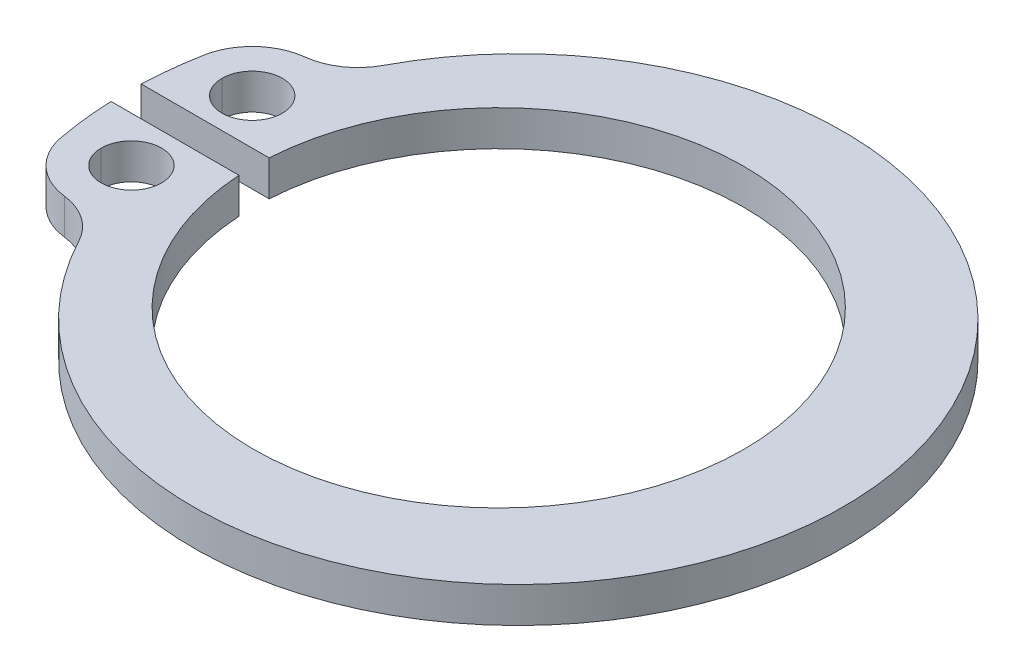
ISO-10303-21;
HEADER;
FILE_DESCRIPTION(('STEP AP214'),'2;1');
FILE_NAME('part.step','',(''),(''),'','','');
FILE_SCHEMA(('AUTOMOTIVE_DESIGN { 1 0 10303 214 1 1 1 1 }'));
ENDSEC;
DATA;
#1=APPLICATION_CONTEXT('core data for automotive mechanical design processes');
#2=APPLICATION_PROTOCOL_DEFINITION('international standard','automotive_design',2000,#1);
#3=PRODUCT_CONTEXT('',#1,'mechanical');
#4=PRODUCT('Part','Part','',(#3));
#5=PRODUCT_RELATED_PRODUCT_CATEGORY('part','',(#4));
#6=PRODUCT_DEFINITION_FORMATION('','',#4);
#7=PRODUCT_DEFINITION_CONTEXT('part definition',#1,'design');
#8=PRODUCT_DEFINITION('design','',#6,#7);
#9=PRODUCT_DEFINITION_SHAPE('','',#8);
#10=(LENGTH_UNIT() NAMED_UNIT(*) SI_UNIT(.MILLI.,.METRE.));
#11=(NAMED_UNIT(*) PLANE_ANGLE_UNIT() SI_UNIT($,.RADIAN.));
#12=(NAMED_UNIT(*) SI_UNIT($,.STERADIAN.) SOLID_ANGLE_UNIT());
#13=UNCERTAINTY_MEASURE_WITH_UNIT(LENGTH_MEASURE(1.E-05),#10,'distance_accuracy_value','');
#14=(GEOMETRIC_REPRESENTATION_CONTEXT(3) GLOBAL_UNCERTAINTY_ASSIGNED_CONTEXT((#13)) GLOBAL_UNIT_ASSIGNED_CONTEXT((#10,
#11,#12)) REPRESENTATION_CONTEXT('',''));
#15=CARTESIAN_POINT('',(0.,0.,0.));
#16=DIRECTION('',(0.,0.,1.));
#17=DIRECTION('',(1.,0.,0.));
#18=AXIS2_PLACEMENT_3D('',#15,#16,#17);
#19=CARTESIAN_POINT('',(-9.039204520387,0.,-5.076382241931));
#20=DIRECTION('',(0.,1.,0.));
#21=DIRECTION('',(1.,0.,0.));
#22=AXIS2_PLACEMENT_3D('',#19,#20,#21);
#23=CYLINDRICAL_SURFACE('',#22,1.7);
#24=DIRECTION('',(0.,1.,0.));
#25=VECTOR('',#24,1.);
#26=CARTESIAN_POINT('',(-8.839177674455,0.,-3.388191120965));
#27=LINE('',#26,#25);
#28=CARTESIAN_POINT('',(-8.839177674455,0.,-3.388191120965));
#29=VERTEX_POINT('',#28);
#30=CARTESIAN_POINT('',(-8.839177674455,1.,-3.388191120965));
#31=VERTEX_POINT('',#30);
#32=EDGE_CURVE('E11',#29,#31,#27,.T.);
#33=ORIENTED_EDGE('',*,*,#32,.T.);
#34=CARTESIAN_POINT('',(-9.039204520387,1.,-5.076382241931));
#35=DIRECTION('',(0.,-1.,0.));
#36=DIRECTION('',(0.883797651648546,0.,0.467869331053571));
#37=AXIS2_PLACEMENT_3D('',#34,#35,#36);
#38=CIRCLE('',#37,1.7);
#39=CARTESIAN_POINT('',(-7.536748512584,1.,-4.28100437914));
#40=VERTEX_POINT('',#39);
#41=EDGE_CURVE('E230',#40,#31,#38,.T.);
#42=ORIENTED_EDGE('',*,*,#41,.F.);
#43=DIRECTION('',(0.,1.,0.));
#44=VECTOR('',#43,1.);
#45=CARTESIAN_POINT('',(-7.536748512584,0.,-4.28100437914));
#46=LINE('',#45,#44);
#47=CARTESIAN_POINT('',(-7.536748512584,0.,-4.28100437914));
#48=VERTEX_POINT('',#47);
#49=EDGE_CURVE('E292',#48,#40,#46,.T.);
#50=ORIENTED_EDGE('',*,*,#49,.F.);
#51=CARTESIAN_POINT('',(-9.039204520387,0.,-5.076382241931));
#52=DIRECTION('',(0.,-1.,0.));
#53=DIRECTION('',(0.883797651648546,0.,0.467869331053571));
#54=AXIS2_PLACEMENT_3D('',#51,#52,#53);
#55=CIRCLE('',#54,1.7);
#56=EDGE_CURVE('E224',#48,#29,#55,.T.);
#57=ORIENTED_EDGE('',*,*,#56,.T.);
#58=EDGE_LOOP('',(#33,#42,#50,#57));
#59=FACE_BOUND('',#58,.T.);
#60=ADVANCED_FACE('F16',(#59),#23,.F.);
#61=CARTESIAN_POINT('',(-8.639150828524,0.,-1.7));
#62=DIRECTION('',(0.,1.,0.));
#63=DIRECTION('',(1.,0.,0.));
#64=AXIS2_PLACEMENT_3D('',#61,#62,#63);
#65=CYLINDRICAL_SURFACE('',#64,1.7);
#66=DIRECTION('',(0.,1.,0.));
#67=VECTOR('',#66,1.);
#68=CARTESIAN_POINT('',(-10.31078540483,0.,-2.009253687609));
#69=LINE('',#68,#67);
#70=CARTESIAN_POINT('',(-10.31078540483,0.,-2.009253687609));
#71=VERTEX_POINT('',#70);
#72=CARTESIAN_POINT('',(-10.31078540483,1.,-2.009253687609));
#73=VERTEX_POINT('',#72);
#74=EDGE_CURVE('E25',#71,#73,#69,.T.);
#75=ORIENTED_EDGE('',*,*,#74,.T.);
#76=CARTESIAN_POINT('',(-8.639150828524,1.,-1.7));
#77=DIRECTION('',(0.,1.,0.));
#78=DIRECTION('',(-0.117662850548003,0.,-0.993053600567924));
#79=AXIS2_PLACEMENT_3D('',#76,#77,#78);
#80=CIRCLE('',#79,1.7);
#81=EDGE_CURVE('E254',#31,#73,#80,.T.);
#82=ORIENTED_EDGE('',*,*,#81,.F.);
#83=ORIENTED_EDGE('',*,*,#32,.F.);
#84=CARTESIAN_POINT('',(-8.639150828524,0.,-1.7));
#85=DIRECTION('',(0.,1.,0.));
#86=DIRECTION('',(-0.117662850548003,0.,-0.993053600567924));
#87=AXIS2_PLACEMENT_3D('',#84,#85,#86);
#88=CIRCLE('',#87,1.7);
#89=EDGE_CURVE('E219',#29,#71,#88,.T.);
#90=ORIENTED_EDGE('',*,*,#89,.T.);
#91=EDGE_LOOP('',(#75,#82,#83,#90));
#92=FACE_BOUND('',#91,.T.);
#93=ADVANCED_FACE('F311',(#92),#65,.T.);
#94=CARTESIAN_POINT('',(0.55,0.,0.));
#95=DIRECTION('',(0.,1.,0.));
#96=DIRECTION('',(1.,0.,0.));
#97=AXIS2_PLACEMENT_3D('',#94,#95,#96);
#98=CYLINDRICAL_SURFACE('',#97,11.04507854164);
#99=DIRECTION('',(0.,1.,0.));
#100=VECTOR('',#99,1.);
#101=CARTESIAN_POINT('',(-10.48689879409,0.,-0.425));
#102=LINE('',#101,#100);
#103=CARTESIAN_POINT('',(-10.48689879409,0.,-0.425));
#104=VERTEX_POINT('',#103);
#105=CARTESIAN_POINT('',(-10.48689879409,1.,-0.425));
#106=VERTEX_POINT('',#105);
#107=EDGE_CURVE('E164',#104,#106,#102,.T.);
#108=ORIENTED_EDGE('',*,*,#107,.T.);
#109=CARTESIAN_POINT('',(0.55,1.,0.));
#110=DIRECTION('',(0.,1.,0.));
#111=DIRECTION('',(-0.983314456650295,0.,-0.181913933887799));
#112=AXIS2_PLACEMENT_3D('',#109,#110,#111);
#113=CIRCLE('',#112,11.04507854164);
#114=EDGE_CURVE('E190',#73,#106,#113,.T.);
#115=ORIENTED_EDGE('',*,*,#114,.F.);
#116=ORIENTED_EDGE('',*,*,#74,.F.);
#117=CARTESIAN_POINT('',(0.55,0.,0.));
#118=DIRECTION('',(0.,1.,0.));
#119=DIRECTION('',(-0.983314456650295,0.,-0.181913933887799));
#120=AXIS2_PLACEMENT_3D('',#117,#118,#119);
#121=CIRCLE('',#120,11.04507854164);
#122=EDGE_CURVE('E173',#71,#104,#121,.T.);
#123=ORIENTED_EDGE('',*,*,#122,.T.);
#124=EDGE_LOOP('',(#108,#115,#116,#123));
#125=FACE_BOUND('',#124,.T.);
#126=ADVANCED_FACE('F315',(#125),#98,.T.);
#127=CARTESIAN_POINT('',(-10.48689879409,0.,-0.425));
#128=DIRECTION('',(0.,0.,1.));
#129=DIRECTION('',(1.,0.,0.));
#130=AXIS2_PLACEMENT_3D('',#127,#128,#129);
#131=PLANE('',#130);
#132=DIRECTION('',(0.,1.,0.));
#133=VECTOR('',#132,1.);
#134=CARTESIAN_POINT('',(-6.886898794087,0.,-0.425));
#135=LINE('',#134,#133);
#136=CARTESIAN_POINT('',(-6.886898794087,0.,-0.425));
#137=VERTEX_POINT('',#136);
#138=CARTESIAN_POINT('',(-6.886898794087,1.,-0.425));
#139=VERTEX_POINT('',#138);
#140=EDGE_CURVE('E152',#137,#139,#135,.T.);
#141=ORIENTED_EDGE('',*,*,#140,.T.);
#142=DIRECTION('',(1.,0.,0.));
#143=VECTOR('',#142,1.);
#144=CARTESIAN_POINT('',(-10.48689879409,1.,-0.425));
#145=LINE('',#144,#143);
#146=EDGE_CURVE('E258',#106,#139,#145,.T.);
#147=ORIENTED_EDGE('',*,*,#146,.F.);
#148=ORIENTED_EDGE('',*,*,#107,.F.);
#149=DIRECTION('',(1.,0.,0.));
#150=VECTOR('',#149,1.);
#151=CARTESIAN_POINT('',(-10.48689879409,0.,-0.425));
#152=LINE('',#151,#150);
#153=EDGE_CURVE('E168',#104,#137,#152,.T.);
#154=ORIENTED_EDGE('',*,*,#153,.T.);
#155=EDGE_LOOP('',(#141,#147,#148,#154));
#156=FACE_BOUND('',#155,.T.);
#157=ADVANCED_FACE('F18',(#156),#131,.T.);
#158=CARTESIAN_POINT('',(0.,0.,0.));
#159=DIRECTION('',(0.,1.,0.));
#160=DIRECTION('',(1.,0.,0.));
#161=AXIS2_PLACEMENT_3D('',#158,#159,#160);
#162=CYLINDRICAL_SURFACE('',#161,6.9);
#163=DIRECTION('',(0.,1.,0.));
#164=VECTOR('',#163,1.);
#165=CARTESIAN_POINT('',(-6.886898794087,0.,0.425));
#166=LINE('',#165,#164);
#167=CARTESIAN_POINT('',(-6.886898794087,0.,0.425));
#168=VERTEX_POINT('',#167);
#169=CARTESIAN_POINT('',(-6.886898794087,1.,0.425));
#170=VERTEX_POINT('',#169);
#171=EDGE_CURVE('E165',#168,#170,#166,.T.);
#172=ORIENTED_EDGE('',*,*,#171,.T.);
#173=CARTESIAN_POINT('',(0.,1.,0.));
#174=DIRECTION('',(0.,-1.,0.));
#175=DIRECTION('',(-0.998101274505394,0.,-0.0615942028985497));
#176=AXIS2_PLACEMENT_3D('',#173,#174,#175);
#177=CIRCLE('',#176,6.9);
#178=EDGE_CURVE('E159',#139,#170,#177,.T.);
#179=ORIENTED_EDGE('',*,*,#178,.F.);
#180=ORIENTED_EDGE('',*,*,#140,.F.);
#181=CARTESIAN_POINT('',(0.,0.,0.));
#182=DIRECTION('',(0.,-1.,0.));
#183=DIRECTION('',(-0.998101274505394,0.,-0.0615942028985497));
#184=AXIS2_PLACEMENT_3D('',#181,#182,#183);
#185=CIRCLE('',#184,6.9);
#186=EDGE_CURVE('E156',#137,#168,#185,.T.);
#187=ORIENTED_EDGE('',*,*,#186,.T.);
#188=EDGE_LOOP('',(#172,#179,#180,#187));
#189=FACE_BOUND('',#188,.T.);
#190=ADVANCED_FACE('F154',(#189),#162,.F.);
#191=CARTESIAN_POINT('',(-6.886898794087,0.,0.425));
#192=DIRECTION('',(0.,0.,-1.));
#193=DIRECTION('',(0.,-1.,0.));
#194=AXIS2_PLACEMENT_3D('',#191,#192,#193);
#195=PLANE('',#194);
#196=DIRECTION('',(0.,1.,0.));
#197=VECTOR('',#196,1.);
#198=CARTESIAN_POINT('',(-10.48689879409,0.,0.425));
#199=LINE('',#198,#197);
#200=CARTESIAN_POINT('',(-10.48689879409,0.,0.425));
#201=VERTEX_POINT('',#200);
#202=CARTESIAN_POINT('',(-10.48689879409,1.,0.425));
#203=VERTEX_POINT('',#202);
#204=EDGE_CURVE('E261',#201,#203,#199,.T.);
#205=ORIENTED_EDGE('',*,*,#204,.T.);
#206=DIRECTION('',(-1.,0.,0.));
#207=VECTOR('',#206,1.);
#208=CARTESIAN_POINT('',(-6.886898794087,1.,0.425));
#209=LINE('',#208,#207);
#210=EDGE_CURVE('E267',#170,#203,#209,.T.);
#211=ORIENTED_EDGE('',*,*,#210,.F.);
#212=ORIENTED_EDGE('',*,*,#171,.F.);
#213=DIRECTION('',(-1.,0.,0.));
#214=VECTOR('',#213,1.);
#215=CARTESIAN_POINT('',(-6.886898794087,0.,0.425));
#216=LINE('',#215,#214);
#217=EDGE_CURVE('E179',#168,#201,#216,.T.);
#218=ORIENTED_EDGE('',*,*,#217,.T.);
#219=EDGE_LOOP('',(#205,#211,#212,#218));
#220=FACE_BOUND('',#219,.T.);
#221=ADVANCED_FACE('F336',(#220),#195,.T.);
#222=CARTESIAN_POINT('',(0.55,0.,0.));
#223=DIRECTION('',(0.,1.,0.));
#224=DIRECTION('',(1.,0.,0.));
#225=AXIS2_PLACEMENT_3D('',#222,#223,#224);
#226=CYLINDRICAL_SURFACE('',#225,11.04507854164);
#227=DIRECTION('',(0.,1.,0.));
#228=VECTOR('',#227,1.);
#229=CARTESIAN_POINT('',(-10.31078540483,0.,2.009253687609));
#230=LINE('',#229,#228);
#231=CARTESIAN_POINT('',(-10.31078540483,0.,2.009253687609));
#232=VERTEX_POINT('',#231);
#233=CARTESIAN_POINT('',(-10.31078540483,1.,2.009253687609));
#234=VERTEX_POINT('',#233);
#235=EDGE_CURVE('E264',#232,#234,#230,.T.);
#236=ORIENTED_EDGE('',*,*,#235,.T.);
#237=CARTESIAN_POINT('',(0.55,1.,0.));
#238=DIRECTION('',(0.,1.,0.));
#239=DIRECTION('',(-0.999259421513512,0.,0.0384786761269205));
#240=AXIS2_PLACEMENT_3D('',#237,#238,#239);
#241=CIRCLE('',#240,11.04507854164);
#242=EDGE_CURVE('E271',#203,#234,#241,.T.);
#243=ORIENTED_EDGE('',*,*,#242,.F.);
#244=ORIENTED_EDGE('',*,*,#204,.F.);
#245=CARTESIAN_POINT('',(0.55,0.,0.));
#246=DIRECTION('',(0.,1.,0.));
#247=DIRECTION('',(-0.999259421513512,0.,0.0384786761269205));
#248=AXIS2_PLACEMENT_3D('',#245,#246,#247);
#249=CIRCLE('',#248,11.04507854164);
#250=EDGE_CURVE('E186',#201,#232,#249,.T.);
#251=ORIENTED_EDGE('',*,*,#250,.T.);
#252=EDGE_LOOP('',(#236,#243,#244,#251));
#253=FACE_BOUND('',#252,.T.);
#254=ADVANCED_FACE('F332',(#253),#226,.T.);
#255=CARTESIAN_POINT('',(-8.639150828524,0.,1.7));
#256=DIRECTION('',(0.,1.,0.));
#257=DIRECTION('',(1.,0.,0.));
#258=AXIS2_PLACEMENT_3D('',#255,#256,#257);
#259=CYLINDRICAL_SURFACE('',#258,1.7);
#260=DIRECTION('',(0.,1.,0.));
#261=VECTOR('',#260,1.);
#262=CARTESIAN_POINT('',(-8.839177674455,0.,3.388191120965));
#263=LINE('',#262,#261);
#264=CARTESIAN_POINT('',(-8.839177674455,0.,3.388191120965));
#265=VERTEX_POINT('',#264);
#266=CARTESIAN_POINT('',(-8.839177674455,1.,3.388191120965));
#267=VERTEX_POINT('',#266);
#268=EDGE_CURVE('E298',#265,#267,#263,.T.);
#269=ORIENTED_EDGE('',*,*,#268,.T.);
#270=CARTESIAN_POINT('',(-8.639150828524,1.,1.7));
#271=DIRECTION('',(0.,1.,0.));
#272=DIRECTION('',(-0.983314456650277,0.,0.181913933887896));
#273=AXIS2_PLACEMENT_3D('',#270,#271,#272);
#274=CIRCLE('',#273,1.7);
#275=EDGE_CURVE('E275',#234,#267,#274,.T.);
#276=ORIENTED_EDGE('',*,*,#275,.F.);
#277=ORIENTED_EDGE('',*,*,#235,.F.);
#278=CARTESIAN_POINT('',(-8.639150828524,0.,1.7));
#279=DIRECTION('',(0.,1.,0.));
#280=DIRECTION('',(-0.983314456650277,0.,0.181913933887896));
#281=AXIS2_PLACEMENT_3D('',#278,#279,#280);
#282=CIRCLE('',#281,1.7);
#283=EDGE_CURVE('E200',#232,#265,#282,.T.);
#284=ORIENTED_EDGE('',*,*,#283,.T.);
#285=EDGE_LOOP('',(#269,#276,#277,#284));
#286=FACE_BOUND('',#285,.T.);
#287=ADVANCED_FACE('F330',(#286),#259,.T.);
#288=CARTESIAN_POINT('',(-9.039204520387,0.,5.076382241931));
#289=DIRECTION('',(0.,1.,0.));
#290=DIRECTION('',(1.,0.,0.));
#291=AXIS2_PLACEMENT_3D('',#288,#289,#290);
#292=CYLINDRICAL_SURFACE('',#291,1.7);
#293=DIRECTION('',(0.,1.,0.));
#294=VECTOR('',#293,1.);
#295=CARTESIAN_POINT('',(-7.536748512584,0.,4.28100437914));
#296=LINE('',#295,#294);
#297=CARTESIAN_POINT('',(-7.536748512584,0.,4.28100437914));
#298=VERTEX_POINT('',#297);
#299=CARTESIAN_POINT('',(-7.536748512584,1.,4.28100437914));
#300=VERTEX_POINT('',#299);
#301=EDGE_CURVE('E295',#298,#300,#296,.T.);
#302=ORIENTED_EDGE('',*,*,#301,.T.);
#303=CARTESIAN_POINT('',(-9.039204520387,1.,5.076382241931));
#304=DIRECTION('',(0.,-1.,0.));
#305=DIRECTION('',(0.117662850547904,0.,-0.993053600567936));
#306=AXIS2_PLACEMENT_3D('',#303,#304,#305);
#307=CIRCLE('',#306,1.7);
#308=EDGE_CURVE('E195',#267,#300,#307,.T.);
#309=ORIENTED_EDGE('',*,*,#308,.F.);
#310=ORIENTED_EDGE('',*,*,#268,.F.);
#311=CARTESIAN_POINT('',(-9.039204520387,0.,5.076382241931));
#312=DIRECTION('',(0.,-1.,0.));
#313=DIRECTION('',(0.117662850547904,0.,-0.993053600567936));
#314=AXIS2_PLACEMENT_3D('',#311,#312,#313);
#315=CIRCLE('',#314,1.7);
#316=EDGE_CURVE('E196',#265,#298,#315,.T.);
#317=ORIENTED_EDGE('',*,*,#316,.T.);
#318=EDGE_LOOP('',(#302,#309,#310,#317));
#319=FACE_BOUND('',#318,.T.);
#320=ADVANCED_FACE('F326',(#319),#292,.F.);
#321=CARTESIAN_POINT('',(0.55,0.,0.));
#322=DIRECTION('',(0.,1.,0.));
#323=DIRECTION('',(1.,0.,0.));
#324=AXIS2_PLACEMENT_3D('',#321,#322,#323);
#325=CYLINDRICAL_SURFACE('',#324,9.15);
#326=ORIENTED_EDGE('',*,*,#49,.T.);
#327=CARTESIAN_POINT('',(0.55,1.,0.));
#328=DIRECTION('',(0.,1.,0.));
#329=DIRECTION('',(-0.883797651648587,0.,0.467869331053493));
#330=AXIS2_PLACEMENT_3D('',#327,#328,#329);
#331=CIRCLE('',#330,9.15);
#332=EDGE_CURVE('E191',#300,#40,#331,.T.);
#333=ORIENTED_EDGE('',*,*,#332,.F.);
#334=ORIENTED_EDGE('',*,*,#301,.F.);
#335=CARTESIAN_POINT('',(0.55,0.,0.));
#336=DIRECTION('',(0.,1.,0.));
#337=DIRECTION('',(-0.883797651648587,0.,0.467869331053493));
#338=AXIS2_PLACEMENT_3D('',#335,#336,#337);
#339=CIRCLE('',#338,9.15);
#340=EDGE_CURVE('E208',#298,#48,#339,.T.);
#341=ORIENTED_EDGE('',*,*,#340,.T.);
#342=EDGE_LOOP('',(#326,#333,#334,#341));
#343=FACE_BOUND('',#342,.T.);
#344=ADVANCED_FACE('F365',(#343),#325,.T.);
#345=CARTESIAN_POINT('',(-8.639150828524,0.,-1.7));
#346=DIRECTION('',(0.,1.,0.));
#347=DIRECTION('',(1.,0.,0.));
#348=AXIS2_PLACEMENT_3D('',#345,#346,#347);
#349=CYLINDRICAL_SURFACE('',#348,0.85);
#350=DIRECTION('',(0.,1.,0.));
#351=VECTOR('',#350,1.);
#352=CARTESIAN_POINT('',(-7.789150828524,0.,-1.7));
#353=LINE('',#352,#351);
#354=CARTESIAN_POINT('',(-7.789150828524,0.,-1.7));
#355=VERTEX_POINT('',#354);
#356=CARTESIAN_POINT('',(-7.789150828524,1.,-1.7));
#357=VERTEX_POINT('',#356);
#358=EDGE_CURVE('E37',#355,#357,#353,.T.);
#359=ORIENTED_EDGE('',*,*,#358,.T.);
#360=CARTESIAN_POINT('',(-8.639150828524,1.,-1.7));
#361=DIRECTION('',(0.,-1.,0.));
#362=DIRECTION('',(-1.,0.,0.));
#363=AXIS2_PLACEMENT_3D('',#360,#361,#362);
#364=CIRCLE('',#363,0.85);
#365=CARTESIAN_POINT('',(-9.489150828524,1.,-1.7));
#366=VERTEX_POINT('',#365);
#367=EDGE_CURVE('E194',#366,#357,#364,.T.);
#368=ORIENTED_EDGE('',*,*,#367,.F.);
#369=DIRECTION('',(0.,1.,0.));
#370=VECTOR('',#369,1.);
#371=CARTESIAN_POINT('',(-9.489150828524,0.,-1.7));
#372=LINE('',#371,#370);
#373=CARTESIAN_POINT('',(-9.489150828524,0.,-1.7));
#374=VERTEX_POINT('',#373);
#375=EDGE_CURVE('E46',#374,#366,#372,.T.);
#376=ORIENTED_EDGE('',*,*,#375,.F.);
#377=CARTESIAN_POINT('',(-8.639150828524,0.,-1.7));
#378=DIRECTION('',(0.,-1.,0.));
#379=DIRECTION('',(-1.,0.,0.));
#380=AXIS2_PLACEMENT_3D('',#377,#378,#379);
#381=CIRCLE('',#380,0.85);
#382=EDGE_CURVE('E204',#374,#355,#381,.T.);
#383=ORIENTED_EDGE('',*,*,#382,.T.);
#384=EDGE_LOOP('',(#359,#368,#376,#383));
#385=FACE_BOUND('',#384,.T.);
#386=ADVANCED_FACE('F361',(#385),#349,.F.);
#387=CARTESIAN_POINT('',(-8.639150828524,0.,-1.7));
#388=DIRECTION('',(0.,1.,0.));
#389=DIRECTION('',(1.,0.,0.));
#390=AXIS2_PLACEMENT_3D('',#387,#388,#389);
#391=CYLINDRICAL_SURFACE('',#390,0.85);
#392=ORIENTED_EDGE('',*,*,#375,.T.);
#393=CARTESIAN_POINT('',(-8.639150828524,1.,-1.7));
#394=DIRECTION('',(0.,-1.,0.));
#395=DIRECTION('',(1.,0.,0.));
#396=AXIS2_PLACEMENT_3D('',#393,#394,#395);
#397=CIRCLE('',#396,0.85);
#398=EDGE_CURVE('E285',#357,#366,#397,.T.);
#399=ORIENTED_EDGE('',*,*,#398,.F.);
#400=ORIENTED_EDGE('',*,*,#358,.F.);
#401=CARTESIAN_POINT('',(-8.639150828524,0.,-1.7));
#402=DIRECTION('',(0.,-1.,0.));
#403=DIRECTION('',(1.,0.,0.));
#404=AXIS2_PLACEMENT_3D('',#401,#402,#403);
#405=CIRCLE('',#404,0.85);
#406=EDGE_CURVE('E207',#355,#374,#405,.T.);
#407=ORIENTED_EDGE('',*,*,#406,.T.);
#408=EDGE_LOOP('',(#392,#399,#400,#407));
#409=FACE_BOUND('',#408,.T.);
#410=ADVANCED_FACE('F364',(#409),#391,.F.);
#411=CARTESIAN_POINT('',(0.,1.,0.));
#412=DIRECTION('',(0.,1.,0.));
#413=DIRECTION('',(1.,0.,0.));
#414=AXIS2_PLACEMENT_3D('',#411,#412,#413);
#415=PLANE('',#414);
#416=CARTESIAN_POINT('',(-8.639150828524,1.,1.7));
#417=DIRECTION('',(0.,-1.,0.));
#418=DIRECTION('',(-1.,0.,0.));
#419=AXIS2_PLACEMENT_3D('',#416,#417,#418);
#420=CIRCLE('',#419,0.85);
#421=CARTESIAN_POINT('',(-9.489150828524,1.,1.7));
#422=VERTEX_POINT('',#421);
#423=CARTESIAN_POINT('',(-7.789150828524,1.,1.7));
#424=VERTEX_POINT('',#423);
#425=EDGE_CURVE('E216',#422,#424,#420,.T.);
#426=ORIENTED_EDGE('',*,*,#425,.T.);
#427=CARTESIAN_POINT('',(-8.639150828524,1.,1.7));
#428=DIRECTION('',(0.,-1.,0.));
#429=DIRECTION('',(1.,0.,0.));
#430=AXIS2_PLACEMENT_3D('',#427,#428,#429);
#431=CIRCLE('',#430,0.85);
#432=EDGE_CURVE('E217',#424,#422,#431,.T.);
#433=ORIENTED_EDGE('',*,*,#432,.T.);
#434=EDGE_LOOP('',(#426,#433));
#435=FACE_BOUND('',#434,.T.);
#436=ORIENTED_EDGE('',*,*,#367,.T.);
#437=ORIENTED_EDGE('',*,*,#398,.T.);
#438=EDGE_LOOP('',(#436,#437));
#439=FACE_BOUND('',#438,.T.);
#440=ORIENTED_EDGE('',*,*,#41,.T.);
#441=ORIENTED_EDGE('',*,*,#81,.T.);
#442=ORIENTED_EDGE('',*,*,#114,.T.);
#443=ORIENTED_EDGE('',*,*,#146,.T.);
#444=ORIENTED_EDGE('',*,*,#178,.T.);
#445=ORIENTED_EDGE('',*,*,#210,.T.);
#446=ORIENTED_EDGE('',*,*,#242,.T.);
#447=ORIENTED_EDGE('',*,*,#275,.T.);
#448=ORIENTED_EDGE('',*,*,#308,.T.);
#449=ORIENTED_EDGE('',*,*,#332,.T.);
#450=EDGE_LOOP('',(#440,#441,#442,#443,#444,#445,#446,#447,#448,#449));
#451=FACE_BOUND('',#450,.T.);
#452=ADVANCED_FACE('F317',(#435,#439,#451),#415,.T.);
#453=CARTESIAN_POINT('',(-8.639150828524,0.,1.7));
#454=DIRECTION('',(0.,1.,0.));
#455=DIRECTION('',(1.,0.,0.));
#456=AXIS2_PLACEMENT_3D('',#453,#454,#455);
#457=CYLINDRICAL_SURFACE('',#456,0.85);
#458=DIRECTION('',(0.,1.,0.));
#459=VECTOR('',#458,1.);
#460=CARTESIAN_POINT('',(-7.789150828524,0.,1.7));
#461=LINE('',#460,#459);
#462=CARTESIAN_POINT('',(-7.789150828524,0.,1.7));
#463=VERTEX_POINT('',#462);
#464=EDGE_CURVE('E212',#463,#424,#461,.T.);
#465=ORIENTED_EDGE('',*,*,#464,.T.);
#466=ORIENTED_EDGE('',*,*,#425,.F.);
#467=DIRECTION('',(0.,1.,0.));
#468=VECTOR('',#467,1.);
#469=CARTESIAN_POINT('',(-9.489150828524,0.,1.7));
#470=LINE('',#469,#468);
#471=CARTESIAN_POINT('',(-9.489150828524,0.,1.7));
#472=VERTEX_POINT('',#471);
#473=EDGE_CURVE('E244',#472,#422,#470,.T.);
#474=ORIENTED_EDGE('',*,*,#473,.F.);
#475=CARTESIAN_POINT('',(-8.639150828524,0.,1.7));
#476=DIRECTION('',(0.,-1.,0.));
#477=DIRECTION('',(-1.,0.,0.));
#478=AXIS2_PLACEMENT_3D('',#475,#476,#477);
#479=CIRCLE('',#478,0.85);
#480=EDGE_CURVE('E234',#472,#463,#479,.T.);
#481=ORIENTED_EDGE('',*,*,#480,.T.);
#482=EDGE_LOOP('',(#465,#466,#474,#481));
#483=FACE_BOUND('',#482,.T.);
#484=ADVANCED_FACE('F357',(#483),#457,.F.);
#485=CARTESIAN_POINT('',(-8.639150828524,0.,1.7));
#486=DIRECTION('',(0.,1.,0.));
#487=DIRECTION('',(1.,0.,0.));
#488=AXIS2_PLACEMENT_3D('',#485,#486,#487);
#489=CYLINDRICAL_SURFACE('',#488,0.85);
#490=ORIENTED_EDGE('',*,*,#473,.T.);
#491=ORIENTED_EDGE('',*,*,#432,.F.);
#492=ORIENTED_EDGE('',*,*,#464,.F.);
#493=CARTESIAN_POINT('',(-8.639150828524,0.,1.7));
#494=DIRECTION('',(0.,-1.,0.));
#495=DIRECTION('',(1.,0.,0.));
#496=AXIS2_PLACEMENT_3D('',#493,#494,#495);
#497=CIRCLE('',#496,0.85);
#498=EDGE_CURVE('E238',#463,#472,#497,.T.);
#499=ORIENTED_EDGE('',*,*,#498,.T.);
#500=EDGE_LOOP('',(#490,#491,#492,#499));
#501=FACE_BOUND('',#500,.T.);
#502=ADVANCED_FACE('F353',(#501),#489,.F.);
#503=CARTESIAN_POINT('',(0.,0.,0.));
#504=DIRECTION('',(0.,1.,0.));
#505=DIRECTION('',(1.,0.,0.));
#506=AXIS2_PLACEMENT_3D('',#503,#504,#505);
#507=PLANE('',#506);
#508=ORIENTED_EDGE('',*,*,#480,.F.);
#509=ORIENTED_EDGE('',*,*,#498,.F.);
#510=EDGE_LOOP('',(#508,#509));
#511=FACE_BOUND('',#510,.T.);
#512=ORIENTED_EDGE('',*,*,#382,.F.);
#513=ORIENTED_EDGE('',*,*,#406,.F.);
#514=EDGE_LOOP('',(#512,#513));
#515=FACE_BOUND('',#514,.T.);
#516=ORIENTED_EDGE('',*,*,#316,.F.);
#517=ORIENTED_EDGE('',*,*,#283,.F.);
#518=ORIENTED_EDGE('',*,*,#250,.F.);
#519=ORIENTED_EDGE('',*,*,#217,.F.);
#520=ORIENTED_EDGE('',*,*,#186,.F.);
#521=ORIENTED_EDGE('',*,*,#153,.F.);
#522=ORIENTED_EDGE('',*,*,#122,.F.);
#523=ORIENTED_EDGE('',*,*,#89,.F.);
#524=ORIENTED_EDGE('',*,*,#56,.F.);
#525=ORIENTED_EDGE('',*,*,#340,.F.);
#526=EDGE_LOOP('',(#516,#517,#518,#519,#520,#521,#522,#523,#524,#525));
#527=FACE_BOUND('',#526,.T.);
#528=ADVANCED_FACE('F176',(#511,#515,#527),#507,.F.);
#529=CLOSED_SHELL('',(#60,#93,#126,#157,#190,#221,#254,#287,#320,#344,#386,#410,#452,#484,#502,#528));
#530=MANIFOLD_SOLID_BREP('B1',#529);
#531=ADVANCED_BREP_SHAPE_REPRESENTATION('',(#18,#530),#14);
#532=SHAPE_DEFINITION_REPRESENTATION(#9,#531);
ENDSEC;
END-ISO-10303-21;
